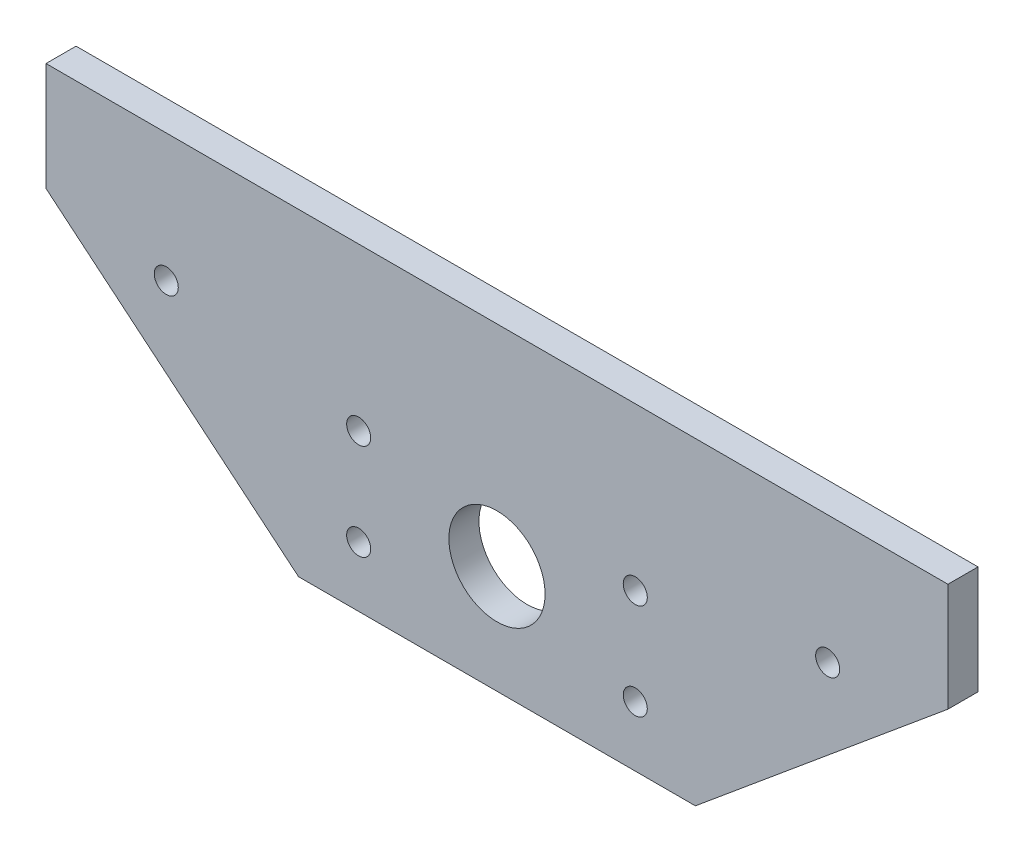
ISO-10303-21;
HEADER;
FILE_DESCRIPTION(('STEP AP214'),'2;1');
FILE_NAME('part.step','',(''),(''),'','','');
FILE_SCHEMA(('AUTOMOTIVE_DESIGN { 1 0 10303 214 1 1 1 1 }'));
ENDSEC;
DATA;
#1=APPLICATION_CONTEXT('core data for automotive mechanical design processes');
#2=APPLICATION_PROTOCOL_DEFINITION('international standard','automotive_design',2000,#1);
#3=PRODUCT_CONTEXT('',#1,'mechanical');
#4=PRODUCT('Part','Part','',(#3));
#5=PRODUCT_RELATED_PRODUCT_CATEGORY('part','',(#4));
#6=PRODUCT_DEFINITION_FORMATION('','',#4);
#7=PRODUCT_DEFINITION_CONTEXT('part definition',#1,'design');
#8=PRODUCT_DEFINITION('design','',#6,#7);
#9=PRODUCT_DEFINITION_SHAPE('','',#8);
#10=(LENGTH_UNIT() NAMED_UNIT(*) SI_UNIT(.MILLI.,.METRE.));
#11=(NAMED_UNIT(*) PLANE_ANGLE_UNIT() SI_UNIT($,.RADIAN.));
#12=(NAMED_UNIT(*) SI_UNIT($,.STERADIAN.) SOLID_ANGLE_UNIT());
#13=UNCERTAINTY_MEASURE_WITH_UNIT(LENGTH_MEASURE(1.E-05),#10,'distance_accuracy_value','');
#14=(GEOMETRIC_REPRESENTATION_CONTEXT(3) GLOBAL_UNCERTAINTY_ASSIGNED_CONTEXT((#13)) GLOBAL_UNIT_ASSIGNED_CONTEXT((#10,
#11,#12)) REPRESENTATION_CONTEXT('',''));
#15=CARTESIAN_POINT('',(0.,0.,0.));
#16=DIRECTION('',(0.,0.,1.));
#17=DIRECTION('',(1.,0.,0.));
#18=AXIS2_PLACEMENT_3D('',#15,#16,#17);
#19=CARTESIAN_POINT('',(0.,0.,5.));
#20=DIRECTION('',(0.,0.,1.));
#21=DIRECTION('',(1.,0.,0.));
#22=AXIS2_PLACEMENT_3D('',#19,#20,#21);
#23=PLANE('',#22);
#24=DIRECTION('',(-0.768948531530423,-0.639310688051753,0.));
#25=VECTOR('',#24,1.);
#26=CARTESIAN_POINT('',(75.,16.9191757278377,5.));
#27=LINE('',#26,#25);
#28=CARTESIAN_POINT('',(75.,16.9191757278377,5.));
#29=VERTEX_POINT('',#28);
#30=CARTESIAN_POINT('',(33.,-18.,5.));
#31=VERTEX_POINT('',#30);
#32=EDGE_CURVE('E183',#29,#31,#27,.T.);
#33=ORIENTED_EDGE('',*,*,#32,.F.);
#34=DIRECTION('',(0.,1.,0.));
#35=VECTOR('',#34,1.);
#36=CARTESIAN_POINT('',(75.,34.9191757278377,5.));
#37=LINE('',#36,#35);
#38=CARTESIAN_POINT('',(75.,34.9191757278377,5.));
#39=VERTEX_POINT('',#38);
#40=EDGE_CURVE('E101',#29,#39,#37,.T.);
#41=ORIENTED_EDGE('',*,*,#40,.T.);
#42=DIRECTION('',(-1.,0.,0.));
#43=VECTOR('',#42,1.);
#44=CARTESIAN_POINT('',(-75.,34.9191757278377,5.));
#45=LINE('',#44,#43);
#46=CARTESIAN_POINT('',(-75.,34.9191757278377,5.));
#47=VERTEX_POINT('',#46);
#48=EDGE_CURVE('E64',#39,#47,#45,.T.);
#49=ORIENTED_EDGE('',*,*,#48,.T.);
#50=DIRECTION('',(0.,-1.,0.));
#51=VECTOR('',#50,1.);
#52=CARTESIAN_POINT('',(-75.,34.9191757278377,5.));
#53=LINE('',#52,#51);
#54=CARTESIAN_POINT('',(-75.,16.9191757278377,5.));
#55=VERTEX_POINT('',#54);
#56=EDGE_CURVE('E92',#47,#55,#53,.T.);
#57=ORIENTED_EDGE('',*,*,#56,.T.);
#58=DIRECTION('',(-0.768948531530424,0.639310688051752,0.));
#59=VECTOR('',#58,1.);
#60=CARTESIAN_POINT('',(-75.,16.9191757278377,5.));
#61=LINE('',#60,#59);
#62=CARTESIAN_POINT('',(-33.,-18.,5.));
#63=VERTEX_POINT('',#62);
#64=EDGE_CURVE('E55',#63,#55,#61,.T.);
#65=ORIENTED_EDGE('',*,*,#64,.F.);
#66=DIRECTION('',(-1.,0.,0.));
#67=VECTOR('',#66,1.);
#68=CARTESIAN_POINT('',(-33.,-18.,5.));
#69=LINE('',#68,#67);
#70=EDGE_CURVE('E190',#31,#63,#69,.T.);
#71=ORIENTED_EDGE('',*,*,#70,.F.);
#72=EDGE_LOOP('',(#33,#41,#49,#57,#65,#71));
#73=FACE_BOUND('',#72,.T.);
#74=CARTESIAN_POINT('',(55.,13.6490091899119,5.));
#75=DIRECTION('',(0.,0.,1.));
#76=DIRECTION('',(-1.,0.,0.));
#77=AXIS2_PLACEMENT_3D('',#74,#75,#76);
#78=CIRCLE('',#77,2.);
#79=CARTESIAN_POINT('',(53.,13.6490091899119,5.));
#80=VERTEX_POINT('',#79);
#81=EDGE_CURVE('E161',#80,#80,#78,.T.);
#82=ORIENTED_EDGE('',*,*,#81,.F.);
#83=EDGE_LOOP('',(#82));
#84=FACE_BOUND('',#83,.T.);
#85=CARTESIAN_POINT('',(-55.,13.6490091899118,5.));
#86=DIRECTION('',(0.,0.,1.));
#87=DIRECTION('',(1.,0.,0.));
#88=AXIS2_PLACEMENT_3D('',#85,#86,#87);
#89=CIRCLE('',#88,2.);
#90=CARTESIAN_POINT('',(-53.,13.6490091899118,5.));
#91=VERTEX_POINT('',#90);
#92=EDGE_CURVE('E153',#91,#91,#89,.T.);
#93=ORIENTED_EDGE('',*,*,#92,.F.);
#94=EDGE_LOOP('',(#93));
#95=FACE_BOUND('',#94,.T.);
#96=CARTESIAN_POINT('',(-23.,-8.,5.));
#97=DIRECTION('',(0.,0.,-1.));
#98=DIRECTION('',(-1.,0.,0.));
#99=AXIS2_PLACEMENT_3D('',#96,#97,#98);
#100=CIRCLE('',#99,2.);
#101=CARTESIAN_POINT('',(-25.,-8.,5.));
#102=VERTEX_POINT('',#101);
#103=EDGE_CURVE('E125',#102,#102,#100,.T.);
#104=ORIENTED_EDGE('',*,*,#103,.T.);
#105=EDGE_LOOP('',(#104));
#106=FACE_BOUND('',#105,.T.);
#107=CARTESIAN_POINT('',(-23.,8.,5.));
#108=DIRECTION('',(0.,0.,1.));
#109=DIRECTION('',(1.,0.,0.));
#110=AXIS2_PLACEMENT_3D('',#107,#108,#109);
#111=CIRCLE('',#110,2.);
#112=CARTESIAN_POINT('',(-21.,8.,5.));
#113=VERTEX_POINT('',#112);
#114=EDGE_CURVE('E121',#113,#113,#111,.T.);
#115=ORIENTED_EDGE('',*,*,#114,.F.);
#116=EDGE_LOOP('',(#115));
#117=FACE_BOUND('',#116,.T.);
#118=CARTESIAN_POINT('',(0.,0.,5.));
#119=DIRECTION('',(0.,0.,1.));
#120=DIRECTION('',(1.,0.,0.));
#121=AXIS2_PLACEMENT_3D('',#118,#119,#120);
#122=CIRCLE('',#121,8.);
#123=CARTESIAN_POINT('',(8.,0.,5.));
#124=VERTEX_POINT('',#123);
#125=EDGE_CURVE('E113',#124,#124,#122,.T.);
#126=ORIENTED_EDGE('',*,*,#125,.F.);
#127=EDGE_LOOP('',(#126));
#128=FACE_BOUND('',#127,.T.);
#129=CARTESIAN_POINT('',(23.,-8.,5.));
#130=DIRECTION('',(0.,0.,1.));
#131=DIRECTION('',(1.,0.,0.));
#132=AXIS2_PLACEMENT_3D('',#129,#130,#131);
#133=CIRCLE('',#132,2.);
#134=CARTESIAN_POINT('',(25.,-8.,5.));
#135=VERTEX_POINT('',#134);
#136=EDGE_CURVE('E142',#135,#135,#133,.T.);
#137=ORIENTED_EDGE('',*,*,#136,.F.);
#138=EDGE_LOOP('',(#137));
#139=FACE_BOUND('',#138,.T.);
#140=CARTESIAN_POINT('',(23.,8.,5.));
#141=DIRECTION('',(0.,0.,-1.));
#142=DIRECTION('',(-1.,0.,0.));
#143=AXIS2_PLACEMENT_3D('',#140,#141,#142);
#144=CIRCLE('',#143,2.);
#145=CARTESIAN_POINT('',(21.,8.,5.));
#146=VERTEX_POINT('',#145);
#147=EDGE_CURVE('E133',#146,#146,#144,.T.);
#148=ORIENTED_EDGE('',*,*,#147,.T.);
#149=EDGE_LOOP('',(#148));
#150=FACE_BOUND('',#149,.T.);
#151=ADVANCED_FACE('F39',(#73,#84,#95,#106,#117,#128,#139,#150),#23,.T.);
#152=CARTESIAN_POINT('',(0.,0.,0.));
#153=DIRECTION('',(0.,0.,1.));
#154=DIRECTION('',(1.,0.,0.));
#155=AXIS2_PLACEMENT_3D('',#152,#153,#154);
#156=PLANE('',#155);
#157=CARTESIAN_POINT('',(55.,13.6490091899119,0.));
#158=DIRECTION('',(0.,0.,1.));
#159=DIRECTION('',(-1.,0.,0.));
#160=AXIS2_PLACEMENT_3D('',#157,#158,#159);
#161=CIRCLE('',#160,2.);
#162=CARTESIAN_POINT('',(53.,13.6490091899119,0.));
#163=VERTEX_POINT('',#162);
#164=EDGE_CURVE('E157',#163,#163,#161,.T.);
#165=ORIENTED_EDGE('',*,*,#164,.T.);
#166=EDGE_LOOP('',(#165));
#167=FACE_BOUND('',#166,.T.);
#168=CARTESIAN_POINT('',(-55.,13.6490091899118,0.));
#169=DIRECTION('',(0.,0.,1.));
#170=DIRECTION('',(1.,0.,0.));
#171=AXIS2_PLACEMENT_3D('',#168,#169,#170);
#172=CIRCLE('',#171,2.);
#173=CARTESIAN_POINT('',(-53.,13.6490091899118,0.));
#174=VERTEX_POINT('',#173);
#175=EDGE_CURVE('E134',#174,#174,#172,.T.);
#176=ORIENTED_EDGE('',*,*,#175,.T.);
#177=EDGE_LOOP('',(#176));
#178=FACE_BOUND('',#177,.T.);
#179=CARTESIAN_POINT('',(23.,-8.,0.));
#180=DIRECTION('',(0.,0.,1.));
#181=DIRECTION('',(1.,0.,0.));
#182=AXIS2_PLACEMENT_3D('',#179,#180,#181);
#183=CIRCLE('',#182,2.);
#184=CARTESIAN_POINT('',(25.,-8.,0.));
#185=VERTEX_POINT('',#184);
#186=EDGE_CURVE('E138',#185,#185,#183,.T.);
#187=ORIENTED_EDGE('',*,*,#186,.T.);
#188=EDGE_LOOP('',(#187));
#189=FACE_BOUND('',#188,.T.);
#190=CARTESIAN_POINT('',(-23.,8.,0.));
#191=DIRECTION('',(0.,0.,1.));
#192=DIRECTION('',(1.,0.,0.));
#193=AXIS2_PLACEMENT_3D('',#190,#191,#192);
#194=CIRCLE('',#193,2.);
#195=CARTESIAN_POINT('',(-21.,8.,0.));
#196=VERTEX_POINT('',#195);
#197=EDGE_CURVE('E117',#196,#196,#194,.T.);
#198=ORIENTED_EDGE('',*,*,#197,.T.);
#199=EDGE_LOOP('',(#198));
#200=FACE_BOUND('',#199,.T.);
#201=CARTESIAN_POINT('',(0.,0.,0.));
#202=DIRECTION('',(0.,0.,1.));
#203=DIRECTION('',(1.,0.,0.));
#204=AXIS2_PLACEMENT_3D('',#201,#202,#203);
#205=CIRCLE('',#204,8.);
#206=CARTESIAN_POINT('',(8.,0.,0.));
#207=VERTEX_POINT('',#206);
#208=EDGE_CURVE('E108',#207,#207,#205,.T.);
#209=ORIENTED_EDGE('',*,*,#208,.T.);
#210=EDGE_LOOP('',(#209));
#211=FACE_BOUND('',#210,.T.);
#212=DIRECTION('',(0.,1.,0.));
#213=VECTOR('',#212,1.);
#214=CARTESIAN_POINT('',(75.,34.9191757278377,0.));
#215=LINE('',#214,#213);
#216=CARTESIAN_POINT('',(75.,16.9191757278377,0.));
#217=VERTEX_POINT('',#216);
#218=CARTESIAN_POINT('',(75.,34.9191757278377,0.));
#219=VERTEX_POINT('',#218);
#220=EDGE_CURVE('E86',#217,#219,#215,.T.);
#221=ORIENTED_EDGE('',*,*,#220,.F.);
#222=DIRECTION('',(-0.768948531530423,-0.639310688051753,0.));
#223=VECTOR('',#222,1.);
#224=CARTESIAN_POINT('',(75.,16.9191757278377,0.));
#225=LINE('',#224,#223);
#226=CARTESIAN_POINT('',(33.,-18.,0.));
#227=VERTEX_POINT('',#226);
#228=EDGE_CURVE('E173',#217,#227,#225,.T.);
#229=ORIENTED_EDGE('',*,*,#228,.T.);
#230=DIRECTION('',(-1.,0.,0.));
#231=VECTOR('',#230,1.);
#232=CARTESIAN_POINT('',(-33.,-18.,0.));
#233=LINE('',#232,#231);
#234=CARTESIAN_POINT('',(-33.,-18.,0.));
#235=VERTEX_POINT('',#234);
#236=EDGE_CURVE('E187',#227,#235,#233,.T.);
#237=ORIENTED_EDGE('',*,*,#236,.T.);
#238=DIRECTION('',(-0.768948531530424,0.639310688051752,0.));
#239=VECTOR('',#238,1.);
#240=CARTESIAN_POINT('',(-75.,16.9191757278377,0.));
#241=LINE('',#240,#239);
#242=CARTESIAN_POINT('',(-75.,16.9191757278377,0.));
#243=VERTEX_POINT('',#242);
#244=EDGE_CURVE('E99',#235,#243,#241,.T.);
#245=ORIENTED_EDGE('',*,*,#244,.T.);
#246=DIRECTION('',(0.,-1.,0.));
#247=VECTOR('',#246,1.);
#248=CARTESIAN_POINT('',(-75.,34.9191757278377,0.));
#249=LINE('',#248,#247);
#250=CARTESIAN_POINT('',(-75.,34.9191757278377,0.));
#251=VERTEX_POINT('',#250);
#252=EDGE_CURVE('E85',#251,#243,#249,.T.);
#253=ORIENTED_EDGE('',*,*,#252,.F.);
#254=DIRECTION('',(-1.,0.,0.));
#255=VECTOR('',#254,1.);
#256=CARTESIAN_POINT('',(-75.,34.9191757278377,0.));
#257=LINE('',#256,#255);
#258=EDGE_CURVE('E76',#219,#251,#257,.T.);
#259=ORIENTED_EDGE('',*,*,#258,.F.);
#260=EDGE_LOOP('',(#221,#229,#237,#245,#253,#259));
#261=FACE_BOUND('',#260,.T.);
#262=CARTESIAN_POINT('',(-23.,-8.,0.));
#263=DIRECTION('',(0.,0.,-1.));
#264=DIRECTION('',(-1.,0.,0.));
#265=AXIS2_PLACEMENT_3D('',#262,#263,#264);
#266=CIRCLE('',#265,2.);
#267=CARTESIAN_POINT('',(-25.,-8.,0.));
#268=VERTEX_POINT('',#267);
#269=EDGE_CURVE('E146',#268,#268,#266,.T.);
#270=ORIENTED_EDGE('',*,*,#269,.F.);
#271=EDGE_LOOP('',(#270));
#272=FACE_BOUND('',#271,.T.);
#273=CARTESIAN_POINT('',(23.,8.,0.));
#274=DIRECTION('',(0.,0.,-1.));
#275=DIRECTION('',(-1.,0.,0.));
#276=AXIS2_PLACEMENT_3D('',#273,#274,#275);
#277=CIRCLE('',#276,2.);
#278=CARTESIAN_POINT('',(21.,8.,0.));
#279=VERTEX_POINT('',#278);
#280=EDGE_CURVE('E129',#279,#279,#277,.T.);
#281=ORIENTED_EDGE('',*,*,#280,.F.);
#282=EDGE_LOOP('',(#281));
#283=FACE_BOUND('',#282,.T.);
#284=ADVANCED_FACE('F95',(#167,#178,#189,#200,#211,#261,#272,#283),#156,.F.);
#285=CARTESIAN_POINT('',(75.,34.9191757278377,5.));
#286=DIRECTION('',(-1.,0.,0.));
#287=DIRECTION('',(0.,-1.,0.));
#288=AXIS2_PLACEMENT_3D('',#285,#286,#287);
#289=PLANE('',#288);
#290=ORIENTED_EDGE('',*,*,#40,.F.);
#291=DIRECTION('',(0.,0.,1.));
#292=VECTOR('',#291,1.);
#293=CARTESIAN_POINT('',(75.,16.9191757278377,0.));
#294=LINE('',#293,#292);
#295=EDGE_CURVE('E176',#217,#29,#294,.T.);
#296=ORIENTED_EDGE('',*,*,#295,.F.);
#297=ORIENTED_EDGE('',*,*,#220,.T.);
#298=DIRECTION('',(0.,0.,-1.));
#299=VECTOR('',#298,1.);
#300=CARTESIAN_POINT('',(75.,34.9191757278377,5.));
#301=LINE('',#300,#299);
#302=EDGE_CURVE('E11',#39,#219,#301,.T.);
#303=ORIENTED_EDGE('',*,*,#302,.F.);
#304=EDGE_LOOP('',(#290,#296,#297,#303));
#305=FACE_BOUND('',#304,.T.);
#306=ADVANCED_FACE('F41',(#305),#289,.F.);
#307=CARTESIAN_POINT('',(-75.,34.9191757278377,5.));
#308=DIRECTION('',(0.,-1.,0.));
#309=DIRECTION('',(0.,0.,-1.));
#310=AXIS2_PLACEMENT_3D('',#307,#308,#309);
#311=PLANE('',#310);
#312=ORIENTED_EDGE('',*,*,#258,.T.);
#313=DIRECTION('',(0.,0.,-1.));
#314=VECTOR('',#313,1.);
#315=CARTESIAN_POINT('',(-75.,34.9191757278377,5.));
#316=LINE('',#315,#314);
#317=EDGE_CURVE('E48',#47,#251,#316,.T.);
#318=ORIENTED_EDGE('',*,*,#317,.F.);
#319=ORIENTED_EDGE('',*,*,#48,.F.);
#320=ORIENTED_EDGE('',*,*,#302,.T.);
#321=EDGE_LOOP('',(#312,#318,#319,#320));
#322=FACE_BOUND('',#321,.T.);
#323=ADVANCED_FACE('F78',(#322),#311,.F.);
#324=CARTESIAN_POINT('',(-75.,34.9191757278377,5.));
#325=DIRECTION('',(1.,0.,0.));
#326=DIRECTION('',(0.,0.,-1.));
#327=AXIS2_PLACEMENT_3D('',#324,#325,#326);
#328=PLANE('',#327);
#329=ORIENTED_EDGE('',*,*,#252,.T.);
#330=DIRECTION('',(0.,0.,1.));
#331=VECTOR('',#330,1.);
#332=CARTESIAN_POINT('',(-75.,16.9191757278377,0.));
#333=LINE('',#332,#331);
#334=EDGE_CURVE('E172',#243,#55,#333,.T.);
#335=ORIENTED_EDGE('',*,*,#334,.T.);
#336=ORIENTED_EDGE('',*,*,#56,.F.);
#337=ORIENTED_EDGE('',*,*,#317,.T.);
#338=EDGE_LOOP('',(#329,#335,#336,#337));
#339=FACE_BOUND('',#338,.T.);
#340=ADVANCED_FACE('F90',(#339),#328,.F.);
#341=CARTESIAN_POINT('',(0.,0.,0.));
#342=DIRECTION('',(0.,0.,1.));
#343=DIRECTION('',(1.,0.,0.));
#344=AXIS2_PLACEMENT_3D('',#341,#342,#343);
#345=CYLINDRICAL_SURFACE('',#344,8.);
#346=ORIENTED_EDGE('',*,*,#208,.F.);
#347=EDGE_LOOP('',(#346));
#348=FACE_BOUND('',#347,.T.);
#349=ORIENTED_EDGE('',*,*,#125,.T.);
#350=EDGE_LOOP('',(#349));
#351=FACE_BOUND('',#350,.T.);
#352=ADVANCED_FACE('F237',(#348,#351),#345,.F.);
#353=CARTESIAN_POINT('',(-23.,8.,0.));
#354=DIRECTION('',(0.,0.,1.));
#355=DIRECTION('',(1.,0.,0.));
#356=AXIS2_PLACEMENT_3D('',#353,#354,#355);
#357=CYLINDRICAL_SURFACE('',#356,2.);
#358=ORIENTED_EDGE('',*,*,#197,.F.);
#359=EDGE_LOOP('',(#358));
#360=FACE_BOUND('',#359,.T.);
#361=ORIENTED_EDGE('',*,*,#114,.T.);
#362=EDGE_LOOP('',(#361));
#363=FACE_BOUND('',#362,.T.);
#364=ADVANCED_FACE('F244',(#360,#363),#357,.F.);
#365=CARTESIAN_POINT('',(-23.,-8.,0.));
#366=DIRECTION('',(0.,0.,1.));
#367=DIRECTION('',(1.,0.,0.));
#368=AXIS2_PLACEMENT_3D('',#365,#366,#367);
#369=CYLINDRICAL_SURFACE('',#368,2.);
#370=ORIENTED_EDGE('',*,*,#269,.T.);
#371=EDGE_LOOP('',(#370));
#372=FACE_BOUND('',#371,.T.);
#373=ORIENTED_EDGE('',*,*,#103,.F.);
#374=EDGE_LOOP('',(#373));
#375=FACE_BOUND('',#374,.T.);
#376=ADVANCED_FACE('F249',(#372,#375),#369,.F.);
#377=CARTESIAN_POINT('',(23.,-8.,0.));
#378=DIRECTION('',(0.,0.,1.));
#379=DIRECTION('',(1.,0.,0.));
#380=AXIS2_PLACEMENT_3D('',#377,#378,#379);
#381=CYLINDRICAL_SURFACE('',#380,2.);
#382=ORIENTED_EDGE('',*,*,#186,.F.);
#383=EDGE_LOOP('',(#382));
#384=FACE_BOUND('',#383,.T.);
#385=ORIENTED_EDGE('',*,*,#136,.T.);
#386=EDGE_LOOP('',(#385));
#387=FACE_BOUND('',#386,.T.);
#388=ADVANCED_FACE('F263',(#384,#387),#381,.F.);
#389=CARTESIAN_POINT('',(23.,8.,0.));
#390=DIRECTION('',(0.,0.,1.));
#391=DIRECTION('',(1.,0.,0.));
#392=AXIS2_PLACEMENT_3D('',#389,#390,#391);
#393=CYLINDRICAL_SURFACE('',#392,2.);
#394=ORIENTED_EDGE('',*,*,#280,.T.);
#395=EDGE_LOOP('',(#394));
#396=FACE_BOUND('',#395,.T.);
#397=ORIENTED_EDGE('',*,*,#147,.F.);
#398=EDGE_LOOP('',(#397));
#399=FACE_BOUND('',#398,.T.);
#400=ADVANCED_FACE('F260',(#396,#399),#393,.F.);
#401=CARTESIAN_POINT('',(-55.,13.6490091899118,0.));
#402=DIRECTION('',(0.,0.,1.));
#403=DIRECTION('',(1.,0.,0.));
#404=AXIS2_PLACEMENT_3D('',#401,#402,#403);
#405=CYLINDRICAL_SURFACE('',#404,2.);
#406=ORIENTED_EDGE('',*,*,#175,.F.);
#407=EDGE_LOOP('',(#406));
#408=FACE_BOUND('',#407,.T.);
#409=ORIENTED_EDGE('',*,*,#92,.T.);
#410=EDGE_LOOP('',(#409));
#411=FACE_BOUND('',#410,.T.);
#412=ADVANCED_FACE('F262',(#408,#411),#405,.F.);
#413=CARTESIAN_POINT('',(55.,13.6490091899119,0.));
#414=DIRECTION('',(0.,0.,1.));
#415=DIRECTION('',(1.,0.,0.));
#416=AXIS2_PLACEMENT_3D('',#413,#414,#415);
#417=CYLINDRICAL_SURFACE('',#416,2.);
#418=ORIENTED_EDGE('',*,*,#164,.F.);
#419=EDGE_LOOP('',(#418));
#420=FACE_BOUND('',#419,.T.);
#421=ORIENTED_EDGE('',*,*,#81,.T.);
#422=EDGE_LOOP('',(#421));
#423=FACE_BOUND('',#422,.T.);
#424=ADVANCED_FACE('F270',(#420,#423),#417,.F.);
#425=CARTESIAN_POINT('',(-33.,-18.,0.));
#426=DIRECTION('',(0.,1.,0.));
#427=DIRECTION('',(0.,0.,1.));
#428=AXIS2_PLACEMENT_3D('',#425,#426,#427);
#429=PLANE('',#428);
#430=ORIENTED_EDGE('',*,*,#70,.T.);
#431=DIRECTION('',(0.,0.,1.));
#432=VECTOR('',#431,1.);
#433=CARTESIAN_POINT('',(-33.,-18.,0.));
#434=LINE('',#433,#432);
#435=EDGE_CURVE('E169',#235,#63,#434,.T.);
#436=ORIENTED_EDGE('',*,*,#435,.F.);
#437=ORIENTED_EDGE('',*,*,#236,.F.);
#438=DIRECTION('',(0.,0.,1.));
#439=VECTOR('',#438,1.);
#440=CARTESIAN_POINT('',(33.,-18.,0.));
#441=LINE('',#440,#439);
#442=EDGE_CURVE('E165',#227,#31,#441,.T.);
#443=ORIENTED_EDGE('',*,*,#442,.T.);
#444=EDGE_LOOP('',(#430,#436,#437,#443));
#445=FACE_BOUND('',#444,.T.);
#446=ADVANCED_FACE('F207',(#445),#429,.F.);
#447=CARTESIAN_POINT('',(75.,16.9191757278377,0.));
#448=DIRECTION('',(-0.639310688051753,0.768948531530423,0.));
#449=DIRECTION('',(-0.768948531530423,-0.639310688051753,0.));
#450=AXIS2_PLACEMENT_3D('',#447,#448,#449);
#451=PLANE('',#450);
#452=ORIENTED_EDGE('',*,*,#32,.T.);
#453=ORIENTED_EDGE('',*,*,#442,.F.);
#454=ORIENTED_EDGE('',*,*,#228,.F.);
#455=ORIENTED_EDGE('',*,*,#295,.T.);
#456=EDGE_LOOP('',(#452,#453,#454,#455));
#457=FACE_BOUND('',#456,.T.);
#458=ADVANCED_FACE('F220',(#457),#451,.F.);
#459=CARTESIAN_POINT('',(-75.,16.9191757278377,0.));
#460=DIRECTION('',(0.639310688051752,0.768948531530424,0.));
#461=DIRECTION('',(-0.768948531530424,0.639310688051752,0.));
#462=AXIS2_PLACEMENT_3D('',#459,#460,#461);
#463=PLANE('',#462);
#464=ORIENTED_EDGE('',*,*,#64,.T.);
#465=ORIENTED_EDGE('',*,*,#334,.F.);
#466=ORIENTED_EDGE('',*,*,#244,.F.);
#467=ORIENTED_EDGE('',*,*,#435,.T.);
#468=EDGE_LOOP('',(#464,#465,#466,#467));
#469=FACE_BOUND('',#468,.T.);
#470=ADVANCED_FACE('F284',(#469),#463,.F.);
#471=CLOSED_SHELL('',(#151,#284,#306,#323,#340,#352,#364,#376,#388,#400,#412,#424,#446,#458,#470));
#472=MANIFOLD_SOLID_BREP('B2',#471);
#473=ADVANCED_BREP_SHAPE_REPRESENTATION('',(#18,#472),#14);
#474=SHAPE_DEFINITION_REPRESENTATION(#9,#473);
ENDSEC;
END-ISO-10303-21;
